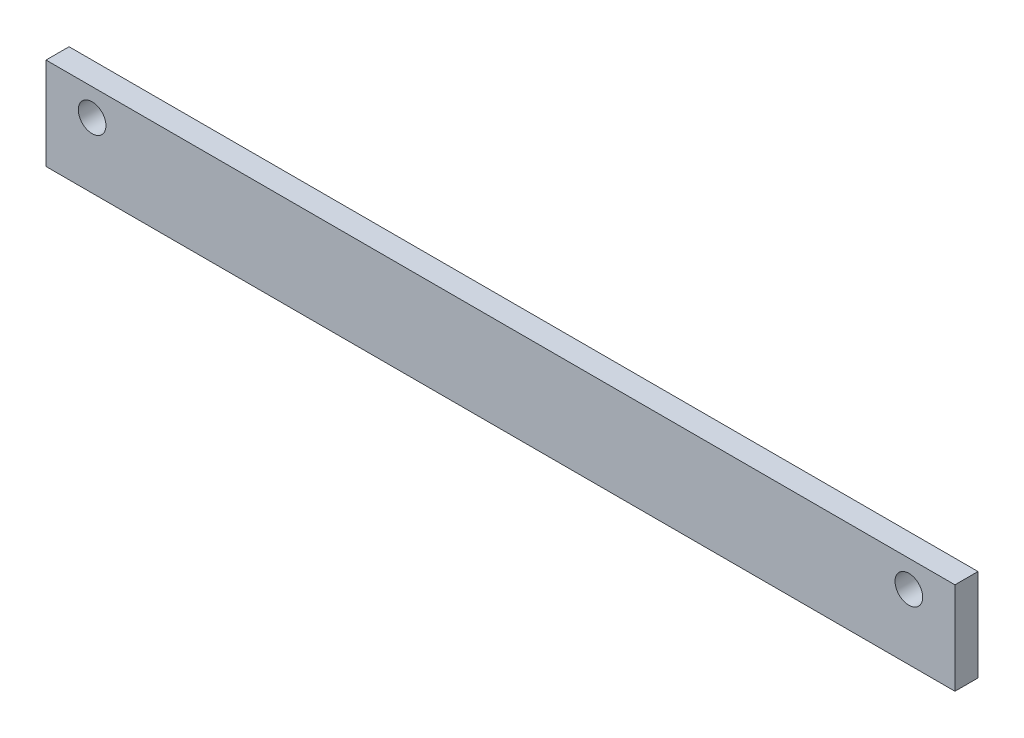
ISO-10303-21;
HEADER;
FILE_DESCRIPTION(('STEP AP214'),'2;1');
FILE_NAME('part.step','',(''),(''),'','','');
FILE_SCHEMA(('AUTOMOTIVE_DESIGN { 1 0 10303 214 1 1 1 1 }'));
ENDSEC;
DATA;
#1=APPLICATION_CONTEXT('core data for automotive mechanical design processes');
#2=APPLICATION_PROTOCOL_DEFINITION('international standard','automotive_design',2000,#1);
#3=PRODUCT_CONTEXT('',#1,'mechanical');
#4=PRODUCT('Part','Part','',(#3));
#5=PRODUCT_RELATED_PRODUCT_CATEGORY('part','',(#4));
#6=PRODUCT_DEFINITION_FORMATION('','',#4);
#7=PRODUCT_DEFINITION_CONTEXT('part definition',#1,'design');
#8=PRODUCT_DEFINITION('design','',#6,#7);
#9=PRODUCT_DEFINITION_SHAPE('','',#8);
#10=(LENGTH_UNIT() NAMED_UNIT(*) SI_UNIT(.MILLI.,.METRE.));
#11=(NAMED_UNIT(*) PLANE_ANGLE_UNIT() SI_UNIT($,.RADIAN.));
#12=(NAMED_UNIT(*) SI_UNIT($,.STERADIAN.) SOLID_ANGLE_UNIT());
#13=UNCERTAINTY_MEASURE_WITH_UNIT(LENGTH_MEASURE(1.E-05),#10,'distance_accuracy_value','');
#14=(GEOMETRIC_REPRESENTATION_CONTEXT(3) GLOBAL_UNCERTAINTY_ASSIGNED_CONTEXT((#13)) GLOBAL_UNIT_ASSIGNED_CONTEXT((#10,
#11,#12)) REPRESENTATION_CONTEXT('',''));
#15=CARTESIAN_POINT('',(0.,0.,0.));
#16=DIRECTION('',(0.,0.,1.));
#17=DIRECTION('',(1.,0.,0.));
#18=AXIS2_PLACEMENT_3D('',#15,#16,#17);
#19=CARTESIAN_POINT('',(0.,0.,5.));
#20=DIRECTION('',(0.,0.,-1.));
#21=DIRECTION('',(-1.,0.,0.));
#22=AXIS2_PLACEMENT_3D('',#19,#20,#21);
#23=PLANE('',#22);
#24=CARTESIAN_POINT('',(0.,128.056431054061,5.));
#25=DIRECTION('',(0.,0.,1.));
#26=DIRECTION('',(1.,0.,0.));
#27=AXIS2_PLACEMENT_3D('',#24,#25,#26);
#28=CIRCLE('',#27,6.00000000000001);
#29=CARTESIAN_POINT('',(6.,128.056431054061,5.));
#30=VERTEX_POINT('',#29);
#31=EDGE_CURVE('E106',#30,#30,#28,.T.);
#32=ORIENTED_EDGE('',*,*,#31,.F.);
#33=EDGE_LOOP('',(#32));
#34=FACE_BOUND('',#33,.T.);
#35=DIRECTION('',(0.,-1.,0.));
#36=VECTOR('',#35,1.);
#37=CARTESIAN_POINT('',(-20.,99.723097720728,5.));
#38=LINE('',#37,#36);
#39=CARTESIAN_POINT('',(-20.,139.723097720728,5.));
#40=VERTEX_POINT('',#39);
#41=CARTESIAN_POINT('',(-20.,99.723097720728,5.));
#42=VERTEX_POINT('',#41);
#43=EDGE_CURVE('E91',#40,#42,#38,.T.);
#44=ORIENTED_EDGE('',*,*,#43,.T.);
#45=DIRECTION('',(1.,0.,0.));
#46=VECTOR('',#45,1.);
#47=CARTESIAN_POINT('',(-20.,99.723097720728,5.));
#48=LINE('',#47,#46);
#49=CARTESIAN_POINT('',(374.303075112574,99.723097720728,5.));
#50=VERTEX_POINT('',#49);
#51=EDGE_CURVE('E86',#42,#50,#48,.T.);
#52=ORIENTED_EDGE('',*,*,#51,.T.);
#53=DIRECTION('',(0.,1.,0.));
#54=VECTOR('',#53,1.);
#55=CARTESIAN_POINT('',(374.303075112574,99.723097720728,5.));
#56=LINE('',#55,#54);
#57=CARTESIAN_POINT('',(374.303075112574,139.723097720728,5.));
#58=VERTEX_POINT('',#57);
#59=EDGE_CURVE('E89',#50,#58,#56,.T.);
#60=ORIENTED_EDGE('',*,*,#59,.T.);
#61=DIRECTION('',(-1.,0.,0.));
#62=VECTOR('',#61,1.);
#63=CARTESIAN_POINT('',(-20.,139.723097720728,5.));
#64=LINE('',#63,#62);
#65=EDGE_CURVE('E56',#58,#40,#64,.T.);
#66=ORIENTED_EDGE('',*,*,#65,.T.);
#67=EDGE_LOOP('',(#44,#52,#60,#66));
#68=FACE_BOUND('',#67,.T.);
#69=CARTESIAN_POINT('',(354.303075112574,128.056431054061,5.));
#70=DIRECTION('',(0.,0.,1.));
#71=DIRECTION('',(-1.,0.,0.));
#72=AXIS2_PLACEMENT_3D('',#69,#70,#71);
#73=CIRCLE('',#72,5.99999999999999);
#74=CARTESIAN_POINT('',(348.303075112574,128.056431054061,5.));
#75=VERTEX_POINT('',#74);
#76=EDGE_CURVE('E121',#75,#75,#73,.T.);
#77=ORIENTED_EDGE('',*,*,#76,.F.);
#78=EDGE_LOOP('',(#77));
#79=FACE_BOUND('',#78,.T.);
#80=ADVANCED_FACE('F39',(#34,#68,#79),#23,.F.);
#81=CARTESIAN_POINT('',(0.,0.,-5.));
#82=DIRECTION('',(0.,0.,-1.));
#83=DIRECTION('',(-1.,0.,0.));
#84=AXIS2_PLACEMENT_3D('',#81,#82,#83);
#85=PLANE('',#84);
#86=CARTESIAN_POINT('',(0.,128.056431054061,-5.));
#87=DIRECTION('',(0.,0.,1.));
#88=DIRECTION('',(1.,0.,0.));
#89=AXIS2_PLACEMENT_3D('',#86,#87,#88);
#90=CIRCLE('',#89,6.00000000000001);
#91=CARTESIAN_POINT('',(6.,128.056431054061,-5.));
#92=VERTEX_POINT('',#91);
#93=EDGE_CURVE('E118',#92,#92,#90,.T.);
#94=ORIENTED_EDGE('',*,*,#93,.T.);
#95=EDGE_LOOP('',(#94));
#96=FACE_BOUND('',#95,.T.);
#97=DIRECTION('',(0.,-1.,0.));
#98=VECTOR('',#97,1.);
#99=CARTESIAN_POINT('',(-20.,99.723097720728,-5.));
#100=LINE('',#99,#98);
#101=CARTESIAN_POINT('',(-20.,139.723097720728,-5.));
#102=VERTEX_POINT('',#101);
#103=CARTESIAN_POINT('',(-20.,99.723097720728,-5.));
#104=VERTEX_POINT('',#103);
#105=EDGE_CURVE('E103',#102,#104,#100,.T.);
#106=ORIENTED_EDGE('',*,*,#105,.F.);
#107=DIRECTION('',(-1.,0.,0.));
#108=VECTOR('',#107,1.);
#109=CARTESIAN_POINT('',(-20.,139.723097720728,-5.));
#110=LINE('',#109,#108);
#111=CARTESIAN_POINT('',(374.303075112574,139.723097720728,-5.));
#112=VERTEX_POINT('',#111);
#113=EDGE_CURVE('E79',#112,#102,#110,.T.);
#114=ORIENTED_EDGE('',*,*,#113,.F.);
#115=DIRECTION('',(0.,1.,0.));
#116=VECTOR('',#115,1.);
#117=CARTESIAN_POINT('',(374.303075112574,99.723097720728,-5.));
#118=LINE('',#117,#116);
#119=CARTESIAN_POINT('',(374.303075112574,99.723097720728,-5.));
#120=VERTEX_POINT('',#119);
#121=EDGE_CURVE('E73',#120,#112,#118,.T.);
#122=ORIENTED_EDGE('',*,*,#121,.F.);
#123=DIRECTION('',(1.,0.,0.));
#124=VECTOR('',#123,1.);
#125=CARTESIAN_POINT('',(-20.,99.723097720728,-5.));
#126=LINE('',#125,#124);
#127=EDGE_CURVE('E95',#104,#120,#126,.T.);
#128=ORIENTED_EDGE('',*,*,#127,.F.);
#129=EDGE_LOOP('',(#106,#114,#122,#128));
#130=FACE_BOUND('',#129,.T.);
#131=CARTESIAN_POINT('',(354.303075112574,128.056431054061,-5.));
#132=DIRECTION('',(0.,0.,1.));
#133=DIRECTION('',(-1.,0.,0.));
#134=AXIS2_PLACEMENT_3D('',#131,#132,#133);
#135=CIRCLE('',#134,5.99999999999999);
#136=CARTESIAN_POINT('',(348.303075112574,128.056431054061,-5.));
#137=VERTEX_POINT('',#136);
#138=EDGE_CURVE('E124',#137,#137,#135,.T.);
#139=ORIENTED_EDGE('',*,*,#138,.T.);
#140=EDGE_LOOP('',(#139));
#141=FACE_BOUND('',#140,.T.);
#142=ADVANCED_FACE('F114',(#96,#130,#141),#85,.T.);
#143=CARTESIAN_POINT('',(-20.,99.723097720728,5.));
#144=DIRECTION('',(1.,0.,0.));
#145=DIRECTION('',(0.,0.,-1.));
#146=AXIS2_PLACEMENT_3D('',#143,#144,#145);
#147=PLANE('',#146);
#148=ORIENTED_EDGE('',*,*,#105,.T.);
#149=DIRECTION('',(0.,0.,-1.));
#150=VECTOR('',#149,1.);
#151=CARTESIAN_POINT('',(-20.,99.723097720728,5.));
#152=LINE('',#151,#150);
#153=EDGE_CURVE('E11',#42,#104,#152,.T.);
#154=ORIENTED_EDGE('',*,*,#153,.F.);
#155=ORIENTED_EDGE('',*,*,#43,.F.);
#156=DIRECTION('',(0.,0.,-1.));
#157=VECTOR('',#156,1.);
#158=CARTESIAN_POINT('',(-20.,139.723097720728,5.));
#159=LINE('',#158,#157);
#160=EDGE_CURVE('E99',#40,#102,#159,.T.);
#161=ORIENTED_EDGE('',*,*,#160,.T.);
#162=EDGE_LOOP('',(#148,#154,#155,#161));
#163=FACE_BOUND('',#162,.T.);
#164=ADVANCED_FACE('F41',(#163),#147,.F.);
#165=CARTESIAN_POINT('',(-20.,99.723097720728,5.));
#166=DIRECTION('',(0.,1.,0.));
#167=DIRECTION('',(0.,0.,1.));
#168=AXIS2_PLACEMENT_3D('',#165,#166,#167);
#169=PLANE('',#168);
#170=ORIENTED_EDGE('',*,*,#127,.T.);
#171=DIRECTION('',(0.,0.,-1.));
#172=VECTOR('',#171,1.);
#173=CARTESIAN_POINT('',(374.303075112574,99.723097720728,5.));
#174=LINE('',#173,#172);
#175=EDGE_CURVE('E48',#50,#120,#174,.T.);
#176=ORIENTED_EDGE('',*,*,#175,.F.);
#177=ORIENTED_EDGE('',*,*,#51,.F.);
#178=ORIENTED_EDGE('',*,*,#153,.T.);
#179=EDGE_LOOP('',(#170,#176,#177,#178));
#180=FACE_BOUND('',#179,.T.);
#181=ADVANCED_FACE('F94',(#180),#169,.F.);
#182=CARTESIAN_POINT('',(374.303075112574,99.723097720728,5.));
#183=DIRECTION('',(-1.,0.,0.));
#184=DIRECTION('',(0.,0.,1.));
#185=AXIS2_PLACEMENT_3D('',#182,#183,#184);
#186=PLANE('',#185);
#187=ORIENTED_EDGE('',*,*,#121,.T.);
#188=DIRECTION('',(0.,0.,-1.));
#189=VECTOR('',#188,1.);
#190=CARTESIAN_POINT('',(374.303075112574,139.723097720728,5.));
#191=LINE('',#190,#189);
#192=EDGE_CURVE('E96',#58,#112,#191,.T.);
#193=ORIENTED_EDGE('',*,*,#192,.F.);
#194=ORIENTED_EDGE('',*,*,#59,.F.);
#195=ORIENTED_EDGE('',*,*,#175,.T.);
#196=EDGE_LOOP('',(#187,#193,#194,#195));
#197=FACE_BOUND('',#196,.T.);
#198=ADVANCED_FACE('F97',(#197),#186,.F.);
#199=CARTESIAN_POINT('',(-20.,139.723097720728,5.));
#200=DIRECTION('',(0.,-1.,0.));
#201=DIRECTION('',(0.,0.,-1.));
#202=AXIS2_PLACEMENT_3D('',#199,#200,#201);
#203=PLANE('',#202);
#204=ORIENTED_EDGE('',*,*,#113,.T.);
#205=ORIENTED_EDGE('',*,*,#160,.F.);
#206=ORIENTED_EDGE('',*,*,#65,.F.);
#207=ORIENTED_EDGE('',*,*,#192,.T.);
#208=EDGE_LOOP('',(#204,#205,#206,#207));
#209=FACE_BOUND('',#208,.T.);
#210=ADVANCED_FACE('F111',(#209),#203,.F.);
#211=CARTESIAN_POINT('',(0.,128.056431054061,5.));
#212=DIRECTION('',(0.,0.,-1.));
#213=DIRECTION('',(-1.,0.,0.));
#214=AXIS2_PLACEMENT_3D('',#211,#212,#213);
#215=CYLINDRICAL_SURFACE('',#214,6.00000000000001);
#216=ORIENTED_EDGE('',*,*,#31,.T.);
#217=EDGE_LOOP('',(#216));
#218=FACE_BOUND('',#217,.T.);
#219=ORIENTED_EDGE('',*,*,#93,.F.);
#220=EDGE_LOOP('',(#219));
#221=FACE_BOUND('',#220,.T.);
#222=ADVANCED_FACE('F142',(#218,#221),#215,.F.);
#223=CARTESIAN_POINT('',(354.303075112574,128.056431054061,5.));
#224=DIRECTION('',(0.,0.,-1.));
#225=DIRECTION('',(-1.,0.,0.));
#226=AXIS2_PLACEMENT_3D('',#223,#224,#225);
#227=CYLINDRICAL_SURFACE('',#226,5.99999999999999);
#228=ORIENTED_EDGE('',*,*,#76,.T.);
#229=EDGE_LOOP('',(#228));
#230=FACE_BOUND('',#229,.T.);
#231=ORIENTED_EDGE('',*,*,#138,.F.);
#232=EDGE_LOOP('',(#231));
#233=FACE_BOUND('',#232,.T.);
#234=ADVANCED_FACE('F130',(#230,#233),#227,.F.);
#235=CLOSED_SHELL('',(#80,#142,#164,#181,#198,#210,#222,#234));
#236=MANIFOLD_SOLID_BREP('B2',#235);
#237=ADVANCED_BREP_SHAPE_REPRESENTATION('',(#18,#236),#14);
#238=SHAPE_DEFINITION_REPRESENTATION(#9,#237);
ENDSEC;
END-ISO-10303-21;
